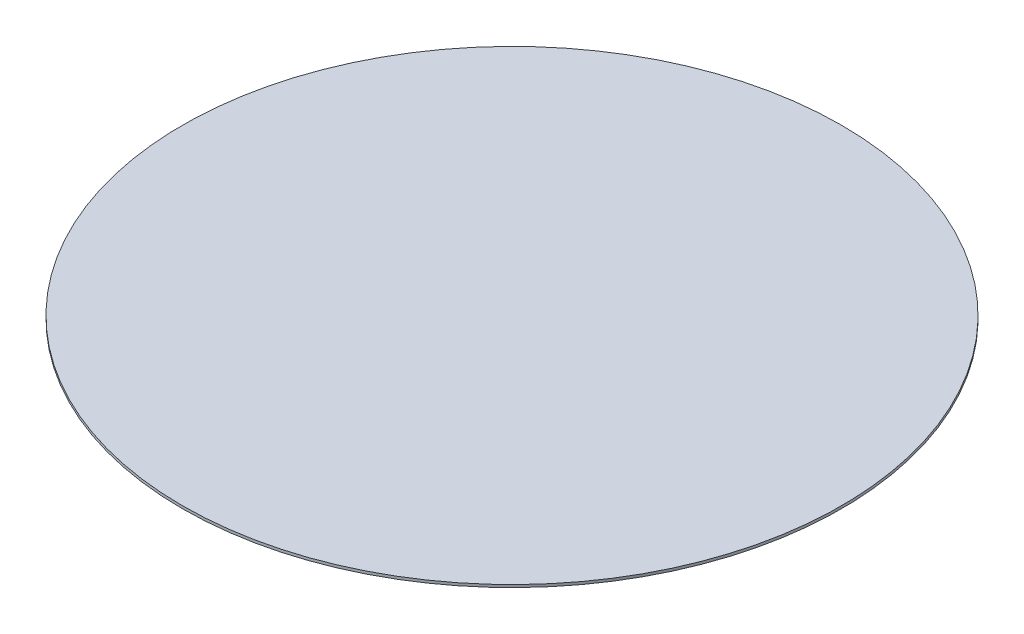
ISO-10303-21;
HEADER;
FILE_DESCRIPTION(('STEP AP214'),'2;1');
FILE_NAME('part.step','',(''),(''),'','','');
FILE_SCHEMA(('AUTOMOTIVE_DESIGN { 1 0 10303 214 1 1 1 1 }'));
ENDSEC;
DATA;
#1=APPLICATION_CONTEXT('core data for automotive mechanical design processes');
#2=APPLICATION_PROTOCOL_DEFINITION('international standard','automotive_design',2000,#1);
#3=PRODUCT_CONTEXT('',#1,'mechanical');
#4=PRODUCT('Part','Part','',(#3));
#5=PRODUCT_RELATED_PRODUCT_CATEGORY('part','',(#4));
#6=PRODUCT_DEFINITION_FORMATION('','',#4);
#7=PRODUCT_DEFINITION_CONTEXT('part definition',#1,'design');
#8=PRODUCT_DEFINITION('design','',#6,#7);
#9=PRODUCT_DEFINITION_SHAPE('','',#8);
#10=(LENGTH_UNIT() NAMED_UNIT(*) SI_UNIT(.MILLI.,.METRE.));
#11=(NAMED_UNIT(*) PLANE_ANGLE_UNIT() SI_UNIT($,.RADIAN.));
#12=(NAMED_UNIT(*) SI_UNIT($,.STERADIAN.) SOLID_ANGLE_UNIT());
#13=UNCERTAINTY_MEASURE_WITH_UNIT(LENGTH_MEASURE(1.E-05),#10,'distance_accuracy_value','');
#14=(GEOMETRIC_REPRESENTATION_CONTEXT(3) GLOBAL_UNCERTAINTY_ASSIGNED_CONTEXT((#13)) GLOBAL_UNIT_ASSIGNED_CONTEXT((#10,
#11,#12)) REPRESENTATION_CONTEXT('',''));
#15=CARTESIAN_POINT('',(0.,0.,0.));
#16=DIRECTION('',(0.,0.,1.));
#17=DIRECTION('',(1.,0.,0.));
#18=AXIS2_PLACEMENT_3D('',#15,#16,#17);
#19=CARTESIAN_POINT('',(0.,0.762,0.));
#20=DIRECTION('',(0.,-1.,0.));
#21=DIRECTION('',(0.,0.,-1.));
#22=AXIS2_PLACEMENT_3D('',#19,#20,#21);
#23=CYLINDRICAL_SURFACE('',#22,95.25);
#24=CARTESIAN_POINT('',(0.,0.762,0.));
#25=DIRECTION('',(0.,1.,0.));
#26=DIRECTION('',(0.,0.,1.));
#27=AXIS2_PLACEMENT_3D('',#24,#25,#26);
#28=CIRCLE('',#27,95.25);
#29=CARTESIAN_POINT('',(0.,0.762,-95.25));
#30=VERTEX_POINT('',#29);
#31=EDGE_CURVE('E10',#30,#30,#28,.T.);
#32=CARTESIAN_POINT('',(0.,0.,0.));
#33=DIRECTION('',(0.,1.,0.));
#34=DIRECTION('',(0.,0.,1.));
#35=AXIS2_PLACEMENT_3D('',#32,#33,#34);
#36=CIRCLE('',#35,95.25);
#37=CARTESIAN_POINT('',(0.,0.,-95.25));
#38=VERTEX_POINT('',#37);
#39=EDGE_CURVE('E40',#38,#38,#36,.T.);
#40=CARTESIAN_POINT('',(0.,0.762,-95.25));
#41=CARTESIAN_POINT('',(0.,0.7540625,-95.25));
#42=CARTESIAN_POINT('',(0.,0.746125,-95.25));
#43=CARTESIAN_POINT('',(0.,0.73025,-95.25));
#44=CARTESIAN_POINT('',(0.,0.7223125,-95.25));
#45=CARTESIAN_POINT('',(0.,0.7064375,-95.25));
#46=CARTESIAN_POINT('',(0.,0.6985,-95.25));
#47=CARTESIAN_POINT('',(0.,0.682625,-95.25));
#48=CARTESIAN_POINT('',(0.,0.6746875,-95.25));
#49=CARTESIAN_POINT('',(0.,0.6588125,-95.25));
#50=CARTESIAN_POINT('',(0.,0.650875,-95.25));
#51=CARTESIAN_POINT('',(0.,0.635,-95.25));
#52=CARTESIAN_POINT('',(0.,0.6270625,-95.25));
#53=CARTESIAN_POINT('',(0.,0.6111875,-95.25));
#54=CARTESIAN_POINT('',(0.,0.60325,-95.25));
#55=CARTESIAN_POINT('',(0.,0.587375,-95.25));
#56=CARTESIAN_POINT('',(0.,0.5794375,-95.25));
#57=CARTESIAN_POINT('',(0.,0.5635625,-95.25));
#58=CARTESIAN_POINT('',(0.,0.555625,-95.25));
#59=CARTESIAN_POINT('',(0.,0.53975,-95.25));
#60=CARTESIAN_POINT('',(0.,0.5318125,-95.25));
#61=CARTESIAN_POINT('',(0.,0.5159375,-95.25));
#62=CARTESIAN_POINT('',(0.,0.508,-95.25));
#63=CARTESIAN_POINT('',(0.,0.492125,-95.25));
#64=CARTESIAN_POINT('',(0.,0.4841875,-95.25));
#65=CARTESIAN_POINT('',(0.,0.4683125,-95.25));
#66=CARTESIAN_POINT('',(0.,0.460375,-95.25));
#67=CARTESIAN_POINT('',(0.,0.4445,-95.25));
#68=CARTESIAN_POINT('',(0.,0.4365625,-95.25));
#69=CARTESIAN_POINT('',(0.,0.4206875,-95.25));
#70=CARTESIAN_POINT('',(0.,0.41275,-95.25));
#71=CARTESIAN_POINT('',(0.,0.396875,-95.25));
#72=CARTESIAN_POINT('',(0.,0.3889375,-95.25));
#73=CARTESIAN_POINT('',(0.,0.3730625,-95.25));
#74=CARTESIAN_POINT('',(0.,0.365125,-95.25));
#75=CARTESIAN_POINT('',(0.,0.34925,-95.25));
#76=CARTESIAN_POINT('',(0.,0.3413125,-95.25));
#77=CARTESIAN_POINT('',(0.,0.3254375,-95.25));
#78=CARTESIAN_POINT('',(0.,0.3175,-95.25));
#79=CARTESIAN_POINT('',(0.,0.301625,-95.25));
#80=CARTESIAN_POINT('',(0.,0.2936875,-95.25));
#81=CARTESIAN_POINT('',(0.,0.2778125,-95.25));
#82=CARTESIAN_POINT('',(0.,0.269875,-95.25));
#83=CARTESIAN_POINT('',(0.,0.254,-95.25));
#84=CARTESIAN_POINT('',(0.,0.2460625,-95.25));
#85=CARTESIAN_POINT('',(0.,0.2301875,-95.25));
#86=CARTESIAN_POINT('',(0.,0.22225,-95.25));
#87=CARTESIAN_POINT('',(0.,0.206375,-95.25));
#88=CARTESIAN_POINT('',(0.,0.1984375,-95.25));
#89=CARTESIAN_POINT('',(0.,0.1825625,-95.25));
#90=CARTESIAN_POINT('',(0.,0.174625,-95.25));
#91=CARTESIAN_POINT('',(0.,0.15875,-95.25));
#92=CARTESIAN_POINT('',(0.,0.1508125,-95.25));
#93=CARTESIAN_POINT('',(0.,0.1349375,-95.25));
#94=CARTESIAN_POINT('',(0.,0.127,-95.25));
#95=CARTESIAN_POINT('',(0.,0.111125,-95.25));
#96=CARTESIAN_POINT('',(0.,0.1031875,-95.25));
#97=CARTESIAN_POINT('',(0.,0.0873125,-95.25));
#98=CARTESIAN_POINT('',(0.,0.079375,-95.25));
#99=CARTESIAN_POINT('',(0.,0.0635,-95.25));
#100=CARTESIAN_POINT('',(0.,0.0555625,-95.25));
#101=CARTESIAN_POINT('',(0.,0.0396875,-95.25));
#102=CARTESIAN_POINT('',(0.,0.03175,-95.25));
#103=CARTESIAN_POINT('',(0.,0.015875,-95.25));
#104=CARTESIAN_POINT('',(0.,0.00793749999999999,-95.25));
#105=CARTESIAN_POINT('',(0.,0.,-95.25));
#106=B_SPLINE_CURVE_WITH_KNOTS('',3,(#40,#41,#42,#43,#44,#45,#46,#47,#48,#49,#50,#51,#52,#53,
#54,#55,#56,#57,#58,#59,#60,#61,#62,#63,#64,#65,#66,#67,#68,#69,#70,#71,#72,#73,#74,#75,#76,#77,
#78,#79,#80,#81,#82,#83,#84,#85,#86,#87,#88,#89,#90,#91,#92,#93,#94,#95,#96,#97,#98,#99,#100,
#101,#102,#103,#104,#105),.UNSPECIFIED.,.F.,.F.,(4,2,2,2,2,2,2,2,2,2,2,2,2,2,2,2,2,2,2,2,2,2,2,
2,2,2,2,2,2,2,2,2,4),(0.,0.0238125000000001,0.047625,0.0714375,0.0952500000000001,0.1190625,
0.142875,0.1666875,0.1905,0.2143125,0.238125,0.2619375,0.28575,0.3095625,0.333375,0.3571875,
0.381,0.4048125,0.428625,0.4524375,0.47625,0.5000625,0.523875,0.5476875,0.5715,0.5953125,
0.619125,0.6429375,0.66675,0.6905625,0.714375,0.7381875,0.762),.UNSPECIFIED.);
#107=EDGE_CURVE('BSEAM37',#30,#38,#106,.T.);
#108=ORIENTED_EDGE('',*,*,#31,.F.);
#109=ORIENTED_EDGE('',*,*,#39,.T.);
#110=ORIENTED_EDGE('',*,*,#107,.T.);
#111=ORIENTED_EDGE('',*,*,#107,.F.);
#112=EDGE_LOOP('',(#108,#110,#109,#111));
#113=FACE_BOUND('',#112,.T.);
#114=ADVANCED_FACE('F37',(#113),#23,.T.);
#115=CARTESIAN_POINT('',(0.,0.762,0.));
#116=DIRECTION('',(0.,1.,0.));
#117=DIRECTION('',(0.,0.,1.));
#118=AXIS2_PLACEMENT_3D('',#115,#116,#117);
#119=PLANE('',#118);
#120=ORIENTED_EDGE('',*,*,#31,.T.);
#121=EDGE_LOOP('',(#120));
#122=FACE_BOUND('',#121,.T.);
#123=ADVANCED_FACE('F54',(#122),#119,.T.);
#124=CARTESIAN_POINT('',(0.,0.,0.));
#125=DIRECTION('',(0.,1.,0.));
#126=DIRECTION('',(0.,0.,1.));
#127=AXIS2_PLACEMENT_3D('',#124,#125,#126);
#128=PLANE('',#127);
#129=ORIENTED_EDGE('',*,*,#39,.F.);
#130=EDGE_LOOP('',(#129));
#131=FACE_BOUND('',#130,.T.);
#132=ADVANCED_FACE('F52',(#131),#128,.F.);
#133=CLOSED_SHELL('',(#114,#123,#132));
#134=MANIFOLD_SOLID_BREP('B2',#133);
#135=ADVANCED_BREP_SHAPE_REPRESENTATION('',(#18,#134),#14);
#136=SHAPE_DEFINITION_REPRESENTATION(#9,#135);
ENDSEC;
END-ISO-10303-21;
